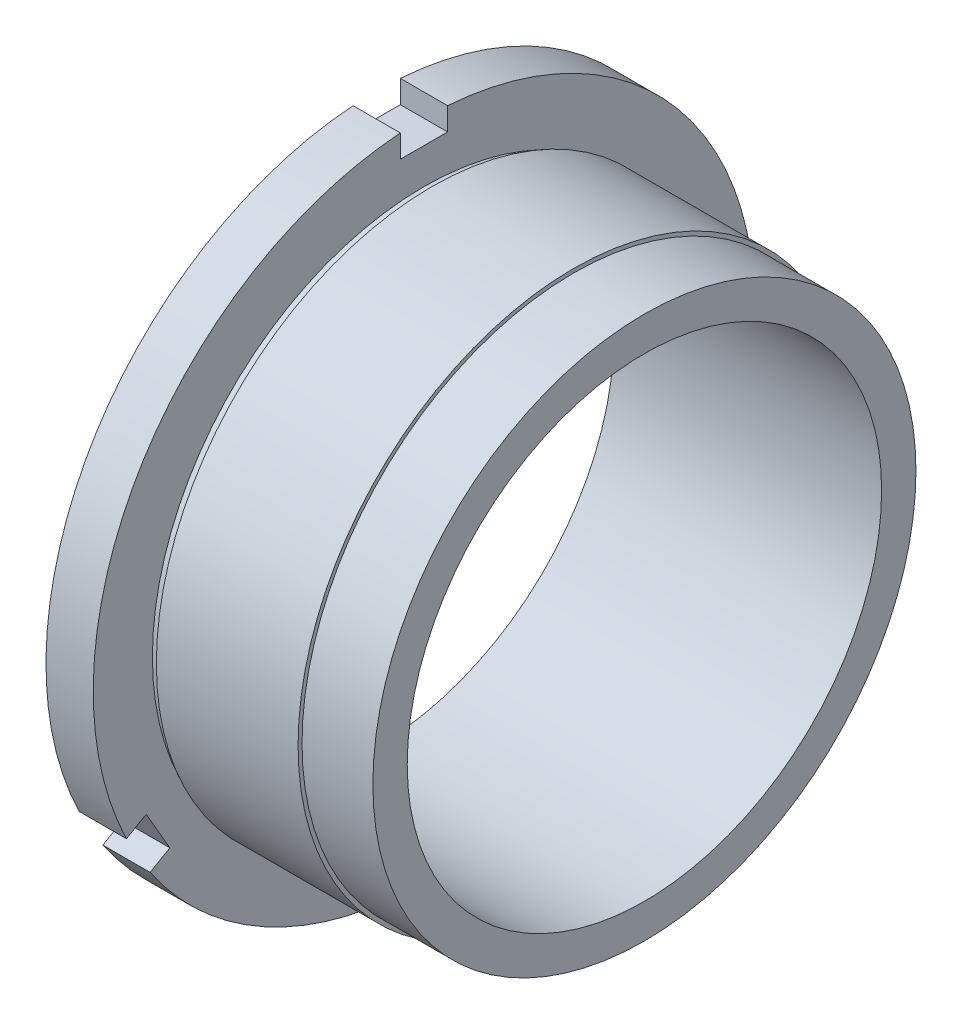
ISO-10303-21;
HEADER;
FILE_DESCRIPTION(('STEP AP214'),'2;1');
FILE_NAME('part.step','',(''),(''),'','','');
FILE_SCHEMA(('AUTOMOTIVE_DESIGN { 1 0 10303 214 1 1 1 1 }'));
ENDSEC;
DATA;
#1=APPLICATION_CONTEXT('core data for automotive mechanical design processes');
#2=APPLICATION_PROTOCOL_DEFINITION('international standard','automotive_design',2000,#1);
#3=PRODUCT_CONTEXT('',#1,'mechanical');
#4=PRODUCT('Part','Part','',(#3));
#5=PRODUCT_RELATED_PRODUCT_CATEGORY('part','',(#4));
#6=PRODUCT_DEFINITION_FORMATION('','',#4);
#7=PRODUCT_DEFINITION_CONTEXT('part definition',#1,'design');
#8=PRODUCT_DEFINITION('design','',#6,#7);
#9=PRODUCT_DEFINITION_SHAPE('','',#8);
#10=(LENGTH_UNIT() NAMED_UNIT(*) SI_UNIT(.MILLI.,.METRE.));
#11=(NAMED_UNIT(*) PLANE_ANGLE_UNIT() SI_UNIT($,.RADIAN.));
#12=(NAMED_UNIT(*) SI_UNIT($,.STERADIAN.) SOLID_ANGLE_UNIT());
#13=UNCERTAINTY_MEASURE_WITH_UNIT(LENGTH_MEASURE(1.E-05),#10,'distance_accuracy_value','');
#14=(GEOMETRIC_REPRESENTATION_CONTEXT(3) GLOBAL_UNCERTAINTY_ASSIGNED_CONTEXT((#13)) GLOBAL_UNIT_ASSIGNED_CONTEXT((#10,
#11,#12)) REPRESENTATION_CONTEXT('',''));
#15=CARTESIAN_POINT('',(0.,0.,0.));
#16=DIRECTION('',(0.,0.,1.));
#17=DIRECTION('',(1.,0.,0.));
#18=AXIS2_PLACEMENT_3D('',#15,#16,#17);
#19=CARTESIAN_POINT('',(0.,0.,0.));
#20=DIRECTION('',(1.,0.,0.));
#21=DIRECTION('',(0.,0.,-1.));
#22=AXIS2_PLACEMENT_3D('',#19,#20,#21);
#23=CYLINDRICAL_SURFACE('',#22,42.);
#24=DIRECTION('',(1.,0.,0.));
#25=VECTOR('',#24,1.);
#26=CARTESIAN_POINT('',(0.,-23.5444362770064,-34.7801598673437));
#27=LINE('',#26,#25);
#28=CARTESIAN_POINT('',(6.,-23.5444362770064,-34.7801598673437));
#29=VERTEX_POINT('',#28);
#30=CARTESIAN_POINT('',(0.,-23.5444362770064,-34.7801598673437));
#31=VERTEX_POINT('',#30);
#32=EDGE_CURVE('E144',#29,#31,#27,.F.);
#33=ORIENTED_EDGE('',*,*,#32,.F.);
#34=CARTESIAN_POINT('',(6.,0.,0.));
#35=DIRECTION('',(1.,0.,0.));
#36=DIRECTION('',(0.,0.,-1.));
#37=AXIS2_PLACEMENT_3D('',#34,#35,#36);
#38=CIRCLE('',#37,42.);
#39=CARTESIAN_POINT('',(6.,-23.5444362770069,34.7801598673434));
#40=VERTEX_POINT('',#39);
#41=EDGE_CURVE('E224',#40,#29,#38,.T.);
#42=ORIENTED_EDGE('',*,*,#41,.F.);
#43=DIRECTION('',(1.,0.,0.));
#44=VECTOR('',#43,1.);
#45=CARTESIAN_POINT('',(0.,-23.5444362770069,34.7801598673434));
#46=LINE('',#45,#44);
#47=CARTESIAN_POINT('',(0.,-23.5444362770069,34.7801598673434));
#48=VERTEX_POINT('',#47);
#49=EDGE_CURVE('E175',#48,#40,#46,.T.);
#50=ORIENTED_EDGE('',*,*,#49,.F.);
#51=CARTESIAN_POINT('',(0.,0.,0.));
#52=DIRECTION('',(1.,0.,0.));
#53=DIRECTION('',(0.,0.,-1.));
#54=AXIS2_PLACEMENT_3D('',#51,#52,#53);
#55=CIRCLE('',#54,42.);
#56=EDGE_CURVE('E229',#48,#31,#55,.T.);
#57=ORIENTED_EDGE('',*,*,#56,.T.);
#58=EDGE_LOOP('',(#33,#42,#50,#57));
#59=FACE_BOUND('',#58,.T.);
#60=ADVANCED_FACE('F50',(#59),#23,.T.);
#61=DIRECTION('',(1.,0.,0.));
#62=VECTOR('',#61,1.);
#63=CARTESIAN_POINT('',(0.,-18.3482838543003,37.7801598673434));
#64=LINE('',#63,#62);
#65=CARTESIAN_POINT('',(6.,-18.3482838543003,37.7801598673434));
#66=VERTEX_POINT('',#65);
#67=CARTESIAN_POINT('',(0.,-18.3482838543003,37.7801598673434));
#68=VERTEX_POINT('',#67);
#69=EDGE_CURVE('E179',#66,#68,#64,.F.);
#70=ORIENTED_EDGE('',*,*,#69,.F.);
#71=CARTESIAN_POINT('',(6.,41.8927201313068,2.99999999999999));
#72=VERTEX_POINT('',#71);
#73=EDGE_CURVE('E220',#72,#66,#38,.T.);
#74=ORIENTED_EDGE('',*,*,#73,.F.);
#75=DIRECTION('',(1.,0.,0.));
#76=VECTOR('',#75,1.);
#77=CARTESIAN_POINT('',(0.,41.8927201313068,2.99999999999999));
#78=LINE('',#77,#76);
#79=CARTESIAN_POINT('',(0.,41.8927201313068,2.99999999999999));
#80=VERTEX_POINT('',#79);
#81=EDGE_CURVE('E191',#80,#72,#78,.T.);
#82=ORIENTED_EDGE('',*,*,#81,.F.);
#83=EDGE_CURVE('E225',#80,#68,#55,.T.);
#84=ORIENTED_EDGE('',*,*,#83,.T.);
#85=EDGE_LOOP('',(#70,#74,#82,#84));
#86=FACE_BOUND('',#85,.T.);
#87=ADVANCED_FACE('F281',(#86),#23,.T.);
#88=CARTESIAN_POINT('',(0.,0.,0.));
#89=DIRECTION('',(1.,0.,0.));
#90=DIRECTION('',(0.,0.,-1.));
#91=AXIS2_PLACEMENT_3D('',#88,#89,#90);
#92=CYLINDRICAL_SURFACE('',#91,30.125);
#93=CARTESIAN_POINT('',(34.,0.,0.));
#94=DIRECTION('',(1.,0.,0.));
#95=DIRECTION('',(0.,0.,-1.));
#96=AXIS2_PLACEMENT_3D('',#93,#94,#95);
#97=CIRCLE('',#96,30.125);
#98=CARTESIAN_POINT('',(34.,0.,-30.125));
#99=VERTEX_POINT('',#98);
#100=EDGE_CURVE('E198',#99,#99,#97,.T.);
#101=ORIENTED_EDGE('',*,*,#100,.T.);
#102=EDGE_LOOP('',(#101));
#103=FACE_BOUND('',#102,.T.);
#104=CARTESIAN_POINT('',(0.,0.,0.));
#105=DIRECTION('',(1.,0.,0.));
#106=DIRECTION('',(0.,0.,-1.));
#107=AXIS2_PLACEMENT_3D('',#104,#105,#106);
#108=CIRCLE('',#107,30.125);
#109=CARTESIAN_POINT('',(0.,0.,-30.125));
#110=VERTEX_POINT('',#109);
#111=EDGE_CURVE('E228',#110,#110,#108,.T.);
#112=ORIENTED_EDGE('',*,*,#111,.F.);
#113=EDGE_LOOP('',(#112));
#114=FACE_BOUND('',#113,.T.);
#115=ADVANCED_FACE('F52',(#103,#114),#92,.F.);
#116=CARTESIAN_POINT('',(0.,30.125,0.));
#117=DIRECTION('',(-1.,0.,0.));
#118=DIRECTION('',(0.,0.,1.));
#119=AXIS2_PLACEMENT_3D('',#116,#117,#118);
#120=PLANE('',#119);
#121=DIRECTION('',(0.,0.499999999999992,0.866025403784443));
#122=VECTOR('',#121,1.);
#123=CARTESIAN_POINT('',(0.,-24.7064747567994,-36.7928695546952));
#124=LINE('',#123,#122);
#125=CARTESIAN_POINT('',(0.,-22.098076211353,-32.2749907475933));
#126=VERTEX_POINT('',#125);
#127=EDGE_CURVE('E138',#31,#126,#124,.T.);
#128=ORIENTED_EDGE('',*,*,#127,.F.);
#129=ORIENTED_EDGE('',*,*,#56,.F.);
#130=DIRECTION('',(0.,-0.500000000000004,0.866025403784436));
#131=VECTOR('',#130,1.);
#132=CARTESIAN_POINT('',(0.,-24.7064747567999,36.7928695546949));
#133=LINE('',#132,#131);
#134=CARTESIAN_POINT('',(0.,-22.0980762113535,32.274990747593));
#135=VERTEX_POINT('',#134);
#136=EDGE_CURVE('E171',#135,#48,#133,.T.);
#137=ORIENTED_EDGE('',*,*,#136,.F.);
#138=DIRECTION('',(0.,-0.866025403784436,-0.500000000000004));
#139=VECTOR('',#138,1.);
#140=CARTESIAN_POINT('',(0.,-16.9019237886468,35.274990747593));
#141=LINE('',#140,#139);
#142=CARTESIAN_POINT('',(0.,-16.9019237886468,35.274990747593));
#143=VERTEX_POINT('',#142);
#144=EDGE_CURVE('E169',#143,#135,#141,.T.);
#145=ORIENTED_EDGE('',*,*,#144,.F.);
#146=DIRECTION('',(0.,0.500000000000004,-0.866025403784436));
#147=VECTOR('',#146,1.);
#148=CARTESIAN_POINT('',(0.,-19.5103223340932,39.7928695546949));
#149=LINE('',#148,#147);
#150=EDGE_CURVE('E167',#68,#143,#149,.T.);
#151=ORIENTED_EDGE('',*,*,#150,.F.);
#152=ORIENTED_EDGE('',*,*,#83,.F.);
#153=DIRECTION('',(0.,1.,0.));
#154=VECTOR('',#153,1.);
#155=CARTESIAN_POINT('',(0.,44.2167970908927,2.99999999999999));
#156=LINE('',#155,#154);
#157=CARTESIAN_POINT('',(0.,39.,3.));
#158=VERTEX_POINT('',#157);
#159=EDGE_CURVE('E186',#158,#80,#156,.T.);
#160=ORIENTED_EDGE('',*,*,#159,.F.);
#161=DIRECTION('',(0.,0.,1.));
#162=VECTOR('',#161,1.);
#163=CARTESIAN_POINT('',(0.,39.,-3.));
#164=LINE('',#163,#162);
#165=CARTESIAN_POINT('',(0.,39.,-3.));
#166=VERTEX_POINT('',#165);
#167=EDGE_CURVE('E183',#166,#158,#164,.T.);
#168=ORIENTED_EDGE('',*,*,#167,.F.);
#169=DIRECTION('',(0.,-1.,0.));
#170=VECTOR('',#169,1.);
#171=CARTESIAN_POINT('',(0.,44.2167970908927,-3.00000000000001));
#172=LINE('',#171,#170);
#173=CARTESIAN_POINT('',(0.,41.8927201313068,-3.));
#174=VERTEX_POINT('',#173);
#175=EDGE_CURVE('E181',#174,#166,#172,.T.);
#176=ORIENTED_EDGE('',*,*,#175,.F.);
#177=CARTESIAN_POINT('',(0.,-18.3482838542997,-37.7801598673436));
#178=VERTEX_POINT('',#177);
#179=EDGE_CURVE('E223',#178,#174,#55,.T.);
#180=ORIENTED_EDGE('',*,*,#179,.F.);
#181=DIRECTION('',(0.,-0.499999999999992,-0.866025403784443));
#182=VECTOR('',#181,1.);
#183=CARTESIAN_POINT('',(0.,-19.5103223340927,-39.7928695546952));
#184=LINE('',#183,#182);
#185=CARTESIAN_POINT('',(0.,-16.9019237886464,-35.2749907475933));
#186=VERTEX_POINT('',#185);
#187=EDGE_CURVE('E155',#186,#178,#184,.T.);
#188=ORIENTED_EDGE('',*,*,#187,.F.);
#189=DIRECTION('',(0.,0.866025403784443,-0.499999999999992));
#190=VECTOR('',#189,1.);
#191=CARTESIAN_POINT('',(0.,-22.098076211353,-32.2749907475933));
#192=LINE('',#191,#190);
#193=EDGE_CURVE('E149',#126,#186,#192,.T.);
#194=ORIENTED_EDGE('',*,*,#193,.F.);
#195=EDGE_LOOP('',(#128,#129,#137,#145,#151,#152,#160,#168,#176,#180,#188,#194));
#196=FACE_BOUND('',#195,.T.);
#197=ORIENTED_EDGE('',*,*,#111,.T.);
#198=EDGE_LOOP('',(#197));
#199=FACE_BOUND('',#198,.T.);
#200=ADVANCED_FACE('F157',(#196,#199),#120,.T.);
#201=DIRECTION('',(1.,0.,0.));
#202=VECTOR('',#201,1.);
#203=CARTESIAN_POINT('',(0.,-18.3482838542997,-37.7801598673436));
#204=LINE('',#203,#202);
#205=CARTESIAN_POINT('',(6.,-18.3482838542998,-37.7801598673436));
#206=VERTEX_POINT('',#205);
#207=EDGE_CURVE('E163',#178,#206,#204,.T.);
#208=ORIENTED_EDGE('',*,*,#207,.F.);
#209=ORIENTED_EDGE('',*,*,#179,.T.);
#210=DIRECTION('',(1.,0.,0.));
#211=VECTOR('',#210,1.);
#212=CARTESIAN_POINT('',(0.,41.8927201313068,-3.00000000000001));
#213=LINE('',#212,#211);
#214=CARTESIAN_POINT('',(6.,41.8927201313068,-3.00000000000001));
#215=VERTEX_POINT('',#214);
#216=EDGE_CURVE('E195',#215,#174,#213,.F.);
#217=ORIENTED_EDGE('',*,*,#216,.F.);
#218=EDGE_CURVE('E219',#206,#215,#38,.T.);
#219=ORIENTED_EDGE('',*,*,#218,.F.);
#220=EDGE_LOOP('',(#208,#209,#217,#219));
#221=FACE_BOUND('',#220,.T.);
#222=ADVANCED_FACE('F262',(#221),#23,.T.);
#223=CARTESIAN_POINT('',(6.,42.,0.));
#224=DIRECTION('',(1.,0.,0.));
#225=DIRECTION('',(0.,0.,-1.));
#226=AXIS2_PLACEMENT_3D('',#223,#224,#225);
#227=PLANE('',#226);
#228=DIRECTION('',(0.,-0.499999999999992,-0.866025403784443));
#229=VECTOR('',#228,1.);
#230=CARTESIAN_POINT('',(6.,7.90192378864632,19.686533479473));
#231=LINE('',#230,#229);
#232=CARTESIAN_POINT('',(6.,-22.098076211353,-32.2749907475933));
#233=VERTEX_POINT('',#232);
#234=EDGE_CURVE('E12',#233,#29,#231,.T.);
#235=ORIENTED_EDGE('',*,*,#234,.F.);
#236=DIRECTION('',(0.,-0.866025403784443,0.499999999999992));
#237=VECTOR('',#236,1.);
#238=CARTESIAN_POINT('',(6.,12.0000000000006,-51.9615242270663));
#239=LINE('',#238,#237);
#240=CARTESIAN_POINT('',(6.,-16.9019237886464,-35.2749907475933));
#241=VERTEX_POINT('',#240);
#242=EDGE_CURVE('E154',#241,#233,#239,.T.);
#243=ORIENTED_EDGE('',*,*,#242,.F.);
#244=DIRECTION('',(0.,0.499999999999992,0.866025403784443));
#245=VECTOR('',#244,1.);
#246=CARTESIAN_POINT('',(6.,13.098076211353,16.686533479473));
#247=LINE('',#246,#245);
#248=EDGE_CURVE('E58',#206,#241,#247,.T.);
#249=ORIENTED_EDGE('',*,*,#248,.F.);
#250=ORIENTED_EDGE('',*,*,#218,.T.);
#251=DIRECTION('',(0.,1.,0.));
#252=VECTOR('',#251,1.);
#253=CARTESIAN_POINT('',(6.,42.,-3.00000000000001));
#254=LINE('',#253,#252);
#255=CARTESIAN_POINT('',(6.,39.,-3.));
#256=VERTEX_POINT('',#255);
#257=EDGE_CURVE('E237',#256,#215,#254,.T.);
#258=ORIENTED_EDGE('',*,*,#257,.F.);
#259=DIRECTION('',(0.,0.,-1.));
#260=VECTOR('',#259,1.);
#261=CARTESIAN_POINT('',(6.,39.,0.));
#262=LINE('',#261,#260);
#263=CARTESIAN_POINT('',(6.,39.,3.));
#264=VERTEX_POINT('',#263);
#265=EDGE_CURVE('E232',#264,#256,#262,.T.);
#266=ORIENTED_EDGE('',*,*,#265,.F.);
#267=DIRECTION('',(0.,-1.,0.));
#268=VECTOR('',#267,1.);
#269=CARTESIAN_POINT('',(6.,42.,2.99999999999999));
#270=LINE('',#269,#268);
#271=EDGE_CURVE('E234',#72,#264,#270,.T.);
#272=ORIENTED_EDGE('',*,*,#271,.F.);
#273=ORIENTED_EDGE('',*,*,#73,.T.);
#274=DIRECTION('',(0.,-0.500000000000004,0.866025403784436));
#275=VECTOR('',#274,1.);
#276=CARTESIAN_POINT('',(6.,13.0980762113535,-16.6865334794733));
#277=LINE('',#276,#275);
#278=CARTESIAN_POINT('',(6.,-16.9019237886468,35.274990747593));
#279=VERTEX_POINT('',#278);
#280=EDGE_CURVE('E244',#279,#66,#277,.T.);
#281=ORIENTED_EDGE('',*,*,#280,.F.);
#282=DIRECTION('',(0.,0.866025403784436,0.500000000000004));
#283=VECTOR('',#282,1.);
#284=CARTESIAN_POINT('',(6.,11.9999999999997,51.9615242270663));
#285=LINE('',#284,#283);
#286=CARTESIAN_POINT('',(6.,-22.0980762113535,32.274990747593));
#287=VERTEX_POINT('',#286);
#288=EDGE_CURVE('E240',#287,#279,#285,.T.);
#289=ORIENTED_EDGE('',*,*,#288,.F.);
#290=DIRECTION('',(0.,0.500000000000004,-0.866025403784436));
#291=VECTOR('',#290,1.);
#292=CARTESIAN_POINT('',(6.,7.90192378864684,-19.6865334794733));
#293=LINE('',#292,#291);
#294=EDGE_CURVE('E242',#40,#287,#293,.T.);
#295=ORIENTED_EDGE('',*,*,#294,.F.);
#296=ORIENTED_EDGE('',*,*,#41,.T.);
#297=EDGE_LOOP('',(#235,#243,#249,#250,#258,#266,#272,#273,#281,#289,#295,#296));
#298=FACE_BOUND('',#297,.T.);
#299=CARTESIAN_POINT('',(6.,0.,0.));
#300=DIRECTION('',(1.,0.,0.));
#301=DIRECTION('',(0.,0.,-1.));
#302=AXIS2_PLACEMENT_3D('',#299,#300,#301);
#303=CIRCLE('',#302,34.485);
#304=CARTESIAN_POINT('',(6.,0.,-34.485));
#305=VERTEX_POINT('',#304);
#306=EDGE_CURVE('E216',#305,#305,#303,.T.);
#307=ORIENTED_EDGE('',*,*,#306,.F.);
#308=EDGE_LOOP('',(#307));
#309=FACE_BOUND('',#308,.T.);
#310=ADVANCED_FACE('F252',(#298,#309),#227,.T.);
#311=CARTESIAN_POINT('',(0.,0.,0.));
#312=DIRECTION('',(1.,0.,0.));
#313=DIRECTION('',(0.,0.,-1.));
#314=AXIS2_PLACEMENT_3D('',#311,#312,#313);
#315=CYLINDRICAL_SURFACE('',#314,34.485);
#316=ORIENTED_EDGE('',*,*,#306,.T.);
#317=EDGE_LOOP('',(#316));
#318=FACE_BOUND('',#317,.T.);
#319=CARTESIAN_POINT('',(7.,0.,0.));
#320=DIRECTION('',(1.,0.,0.));
#321=DIRECTION('',(0.,0.,-1.));
#322=AXIS2_PLACEMENT_3D('',#319,#320,#321);
#323=CIRCLE('',#322,34.485);
#324=CARTESIAN_POINT('',(7.,0.,-34.485));
#325=VERTEX_POINT('',#324);
#326=EDGE_CURVE('E213',#325,#325,#323,.T.);
#327=ORIENTED_EDGE('',*,*,#326,.F.);
#328=EDGE_LOOP('',(#327));
#329=FACE_BOUND('',#328,.T.);
#330=ADVANCED_FACE('F311',(#318,#329),#315,.T.);
#331=CARTESIAN_POINT('',(7.,34.985,0.));
#332=DIRECTION('',(-1.,0.,0.));
#333=DIRECTION('',(0.,0.,1.));
#334=AXIS2_PLACEMENT_3D('',#331,#332,#333);
#335=PLANE('',#334);
#336=ORIENTED_EDGE('',*,*,#326,.T.);
#337=EDGE_LOOP('',(#336));
#338=FACE_BOUND('',#337,.T.);
#339=CARTESIAN_POINT('',(7.,0.,0.));
#340=DIRECTION('',(1.,0.,0.));
#341=DIRECTION('',(0.,0.,-1.));
#342=AXIS2_PLACEMENT_3D('',#339,#340,#341);
#343=CIRCLE('',#342,34.985);
#344=CARTESIAN_POINT('',(7.,0.,-34.985));
#345=VERTEX_POINT('',#344);
#346=EDGE_CURVE('E210',#345,#345,#343,.T.);
#347=ORIENTED_EDGE('',*,*,#346,.F.);
#348=EDGE_LOOP('',(#347));
#349=FACE_BOUND('',#348,.T.);
#350=ADVANCED_FACE('F344',(#338,#349),#335,.T.);
#351=CARTESIAN_POINT('',(0.,0.,0.));
#352=DIRECTION('',(1.,0.,0.));
#353=DIRECTION('',(0.,0.,-1.));
#354=AXIS2_PLACEMENT_3D('',#351,#352,#353);
#355=CYLINDRICAL_SURFACE('',#354,34.985);
#356=ORIENTED_EDGE('',*,*,#346,.T.);
#357=EDGE_LOOP('',(#356));
#358=FACE_BOUND('',#357,.T.);
#359=CARTESIAN_POINT('',(25.,0.,0.));
#360=DIRECTION('',(1.,0.,0.));
#361=DIRECTION('',(0.,0.,-1.));
#362=AXIS2_PLACEMENT_3D('',#359,#360,#361);
#363=CIRCLE('',#362,34.985);
#364=CARTESIAN_POINT('',(25.,0.,-34.985));
#365=VERTEX_POINT('',#364);
#366=EDGE_CURVE('E207',#365,#365,#363,.T.);
#367=ORIENTED_EDGE('',*,*,#366,.F.);
#368=EDGE_LOOP('',(#367));
#369=FACE_BOUND('',#368,.T.);
#370=ADVANCED_FACE('F340',(#358,#369),#355,.T.);
#371=CARTESIAN_POINT('',(25.,34.485,0.));
#372=DIRECTION('',(1.,0.,0.));
#373=DIRECTION('',(0.,0.,-1.));
#374=AXIS2_PLACEMENT_3D('',#371,#372,#373);
#375=PLANE('',#374);
#376=ORIENTED_EDGE('',*,*,#366,.T.);
#377=EDGE_LOOP('',(#376));
#378=FACE_BOUND('',#377,.T.);
#379=CARTESIAN_POINT('',(25.,0.,0.));
#380=DIRECTION('',(1.,0.,0.));
#381=DIRECTION('',(0.,0.,-1.));
#382=AXIS2_PLACEMENT_3D('',#379,#380,#381);
#383=CIRCLE('',#382,34.485);
#384=CARTESIAN_POINT('',(25.,0.,-34.485));
#385=VERTEX_POINT('',#384);
#386=EDGE_CURVE('E204',#385,#385,#383,.T.);
#387=ORIENTED_EDGE('',*,*,#386,.F.);
#388=EDGE_LOOP('',(#387));
#389=FACE_BOUND('',#388,.T.);
#390=ADVANCED_FACE('F333',(#378,#389),#375,.T.);
#391=CARTESIAN_POINT('',(0.,0.,0.));
#392=DIRECTION('',(1.,0.,0.));
#393=DIRECTION('',(0.,0.,-1.));
#394=AXIS2_PLACEMENT_3D('',#391,#392,#393);
#395=CYLINDRICAL_SURFACE('',#394,34.485);
#396=ORIENTED_EDGE('',*,*,#386,.T.);
#397=EDGE_LOOP('',(#396));
#398=FACE_BOUND('',#397,.T.);
#399=CARTESIAN_POINT('',(34.,0.,0.));
#400=DIRECTION('',(1.,0.,0.));
#401=DIRECTION('',(0.,0.,-1.));
#402=AXIS2_PLACEMENT_3D('',#399,#400,#401);
#403=CIRCLE('',#402,34.485);
#404=CARTESIAN_POINT('',(34.,0.,-34.485));
#405=VERTEX_POINT('',#404);
#406=EDGE_CURVE('E201',#405,#405,#403,.T.);
#407=ORIENTED_EDGE('',*,*,#406,.F.);
#408=EDGE_LOOP('',(#407));
#409=FACE_BOUND('',#408,.T.);
#410=ADVANCED_FACE('F324',(#398,#409),#395,.T.);
#411=CARTESIAN_POINT('',(34.,34.485,0.));
#412=DIRECTION('',(1.,0.,0.));
#413=DIRECTION('',(0.,0.,-1.));
#414=AXIS2_PLACEMENT_3D('',#411,#412,#413);
#415=PLANE('',#414);
#416=ORIENTED_EDGE('',*,*,#406,.T.);
#417=EDGE_LOOP('',(#416));
#418=FACE_BOUND('',#417,.T.);
#419=ORIENTED_EDGE('',*,*,#100,.F.);
#420=EDGE_LOOP('',(#419));
#421=FACE_BOUND('',#420,.T.);
#422=ADVANCED_FACE('F322',(#418,#421),#415,.T.);
#423=CARTESIAN_POINT('',(34.,44.2167970908927,-3.00000000000001));
#424=DIRECTION('',(0.,0.,-1.));
#425=DIRECTION('',(0.,1.,0.));
#426=AXIS2_PLACEMENT_3D('',#423,#424,#425);
#427=PLANE('',#426);
#428=ORIENTED_EDGE('',*,*,#216,.T.);
#429=ORIENTED_EDGE('',*,*,#175,.T.);
#430=DIRECTION('',(-1.,0.,0.));
#431=VECTOR('',#430,1.);
#432=CARTESIAN_POINT('',(34.,39.,-3.));
#433=LINE('',#432,#431);
#434=EDGE_CURVE('E188',#256,#166,#433,.T.);
#435=ORIENTED_EDGE('',*,*,#434,.F.);
#436=ORIENTED_EDGE('',*,*,#257,.T.);
#437=EDGE_LOOP('',(#428,#429,#435,#436));
#438=FACE_BOUND('',#437,.T.);
#439=ADVANCED_FACE('F265',(#438),#427,.F.);
#440=CARTESIAN_POINT('',(34.,44.2167970908927,2.99999999999999));
#441=DIRECTION('',(0.,0.,1.));
#442=DIRECTION('',(0.,-1.,0.));
#443=AXIS2_PLACEMENT_3D('',#440,#441,#442);
#444=PLANE('',#443);
#445=ORIENTED_EDGE('',*,*,#81,.T.);
#446=ORIENTED_EDGE('',*,*,#271,.T.);
#447=DIRECTION('',(-1.,0.,0.));
#448=VECTOR('',#447,1.);
#449=CARTESIAN_POINT('',(34.,39.,3.));
#450=LINE('',#449,#448);
#451=EDGE_CURVE('E189',#264,#158,#450,.T.);
#452=ORIENTED_EDGE('',*,*,#451,.T.);
#453=ORIENTED_EDGE('',*,*,#159,.T.);
#454=EDGE_LOOP('',(#445,#446,#452,#453));
#455=FACE_BOUND('',#454,.T.);
#456=ADVANCED_FACE('F331',(#455),#444,.F.);
#457=CARTESIAN_POINT('',(34.,39.,-3.));
#458=DIRECTION('',(0.,-1.,0.));
#459=DIRECTION('',(0.,0.,-1.));
#460=AXIS2_PLACEMENT_3D('',#457,#458,#459);
#461=PLANE('',#460);
#462=ORIENTED_EDGE('',*,*,#265,.T.);
#463=ORIENTED_EDGE('',*,*,#434,.T.);
#464=ORIENTED_EDGE('',*,*,#167,.T.);
#465=ORIENTED_EDGE('',*,*,#451,.F.);
#466=EDGE_LOOP('',(#462,#463,#464,#465));
#467=FACE_BOUND('',#466,.T.);
#468=ADVANCED_FACE('F272',(#467),#461,.F.);
#469=CARTESIAN_POINT('',(34.,-19.5103223340932,39.7928695546949));
#470=DIRECTION('',(0.,0.866025403784436,0.500000000000004));
#471=DIRECTION('',(0.,-0.500000000000004,0.866025403784436));
#472=AXIS2_PLACEMENT_3D('',#469,#470,#471);
#473=PLANE('',#472);
#474=ORIENTED_EDGE('',*,*,#69,.T.);
#475=ORIENTED_EDGE('',*,*,#150,.T.);
#476=DIRECTION('',(-1.,0.,0.));
#477=VECTOR('',#476,1.);
#478=CARTESIAN_POINT('',(34.,-16.9019237886468,35.274990747593));
#479=LINE('',#478,#477);
#480=EDGE_CURVE('E173',#279,#143,#479,.T.);
#481=ORIENTED_EDGE('',*,*,#480,.F.);
#482=ORIENTED_EDGE('',*,*,#280,.T.);
#483=EDGE_LOOP('',(#474,#475,#481,#482));
#484=FACE_BOUND('',#483,.T.);
#485=ADVANCED_FACE('F284',(#484),#473,.F.);
#486=CARTESIAN_POINT('',(34.,-24.7064747567999,36.7928695546949));
#487=DIRECTION('',(0.,-0.866025403784436,-0.500000000000004));
#488=DIRECTION('',(0.,0.500000000000004,-0.866025403784436));
#489=AXIS2_PLACEMENT_3D('',#486,#487,#488);
#490=PLANE('',#489);
#491=ORIENTED_EDGE('',*,*,#49,.T.);
#492=ORIENTED_EDGE('',*,*,#294,.T.);
#493=DIRECTION('',(-1.,0.,0.));
#494=VECTOR('',#493,1.);
#495=CARTESIAN_POINT('',(34.,-22.0980762113535,32.274990747593));
#496=LINE('',#495,#494);
#497=EDGE_CURVE('E73',#287,#135,#496,.T.);
#498=ORIENTED_EDGE('',*,*,#497,.T.);
#499=ORIENTED_EDGE('',*,*,#136,.T.);
#500=EDGE_LOOP('',(#491,#492,#498,#499));
#501=FACE_BOUND('',#500,.T.);
#502=ADVANCED_FACE('F290',(#501),#490,.F.);
#503=CARTESIAN_POINT('',(34.,-16.9019237886468,35.274990747593));
#504=DIRECTION('',(0.,0.500000000000004,-0.866025403784436));
#505=DIRECTION('',(0.,0.866025403784436,0.500000000000004));
#506=AXIS2_PLACEMENT_3D('',#503,#504,#505);
#507=PLANE('',#506);
#508=ORIENTED_EDGE('',*,*,#288,.T.);
#509=ORIENTED_EDGE('',*,*,#480,.T.);
#510=ORIENTED_EDGE('',*,*,#144,.T.);
#511=ORIENTED_EDGE('',*,*,#497,.F.);
#512=EDGE_LOOP('',(#508,#509,#510,#511));
#513=FACE_BOUND('',#512,.T.);
#514=ADVANCED_FACE('F287',(#513),#507,.F.);
#515=CARTESIAN_POINT('',(34.,-24.7064747567994,-36.7928695546952));
#516=DIRECTION('',(0.,-0.866025403784443,0.499999999999992));
#517=DIRECTION('',(0.,-0.499999999999992,-0.866025403784443));
#518=AXIS2_PLACEMENT_3D('',#515,#516,#517);
#519=PLANE('',#518);
#520=ORIENTED_EDGE('',*,*,#32,.T.);
#521=ORIENTED_EDGE('',*,*,#127,.T.);
#522=DIRECTION('',(-1.,0.,0.));
#523=VECTOR('',#522,1.);
#524=CARTESIAN_POINT('',(34.,-22.098076211353,-32.2749907475933));
#525=LINE('',#524,#523);
#526=EDGE_CURVE('E141',#233,#126,#525,.T.);
#527=ORIENTED_EDGE('',*,*,#526,.F.);
#528=ORIENTED_EDGE('',*,*,#234,.T.);
#529=EDGE_LOOP('',(#520,#521,#527,#528));
#530=FACE_BOUND('',#529,.T.);
#531=ADVANCED_FACE('F140',(#530),#519,.F.);
#532=CARTESIAN_POINT('',(34.,-19.5103223340927,-39.7928695546952));
#533=DIRECTION('',(0.,0.866025403784443,-0.499999999999992));
#534=DIRECTION('',(0.,0.499999999999992,0.866025403784443));
#535=AXIS2_PLACEMENT_3D('',#532,#533,#534);
#536=PLANE('',#535);
#537=ORIENTED_EDGE('',*,*,#207,.T.);
#538=ORIENTED_EDGE('',*,*,#248,.T.);
#539=DIRECTION('',(-1.,0.,0.));
#540=VECTOR('',#539,1.);
#541=CARTESIAN_POINT('',(34.,-16.9019237886464,-35.2749907475933));
#542=LINE('',#541,#540);
#543=EDGE_CURVE('E65',#241,#186,#542,.T.);
#544=ORIENTED_EDGE('',*,*,#543,.T.);
#545=ORIENTED_EDGE('',*,*,#187,.T.);
#546=EDGE_LOOP('',(#537,#538,#544,#545));
#547=FACE_BOUND('',#546,.T.);
#548=ADVANCED_FACE('F248',(#547),#536,.F.);
#549=CARTESIAN_POINT('',(34.,-22.098076211353,-32.2749907475933));
#550=DIRECTION('',(0.,0.499999999999992,0.866025403784443));
#551=DIRECTION('',(0.,-0.866025403784443,0.499999999999992));
#552=AXIS2_PLACEMENT_3D('',#549,#550,#551);
#553=PLANE('',#552);
#554=ORIENTED_EDGE('',*,*,#242,.T.);
#555=ORIENTED_EDGE('',*,*,#526,.T.);
#556=ORIENTED_EDGE('',*,*,#193,.T.);
#557=ORIENTED_EDGE('',*,*,#543,.F.);
#558=EDGE_LOOP('',(#554,#555,#556,#557));
#559=FACE_BOUND('',#558,.T.);
#560=ADVANCED_FACE('F151',(#559),#553,.F.);
#561=CLOSED_SHELL('',(#60,#87,#115,#200,#222,#310,#330,#350,#370,#390,#410,#422,#439,#456,#468,
#485,#502,#514,#531,#548,#560));
#562=MANIFOLD_SOLID_BREP('B2',#561);
#563=ADVANCED_BREP_SHAPE_REPRESENTATION('',(#18,#562),#14);
#564=SHAPE_DEFINITION_REPRESENTATION(#9,#563);
ENDSEC;
END-ISO-10303-21;
